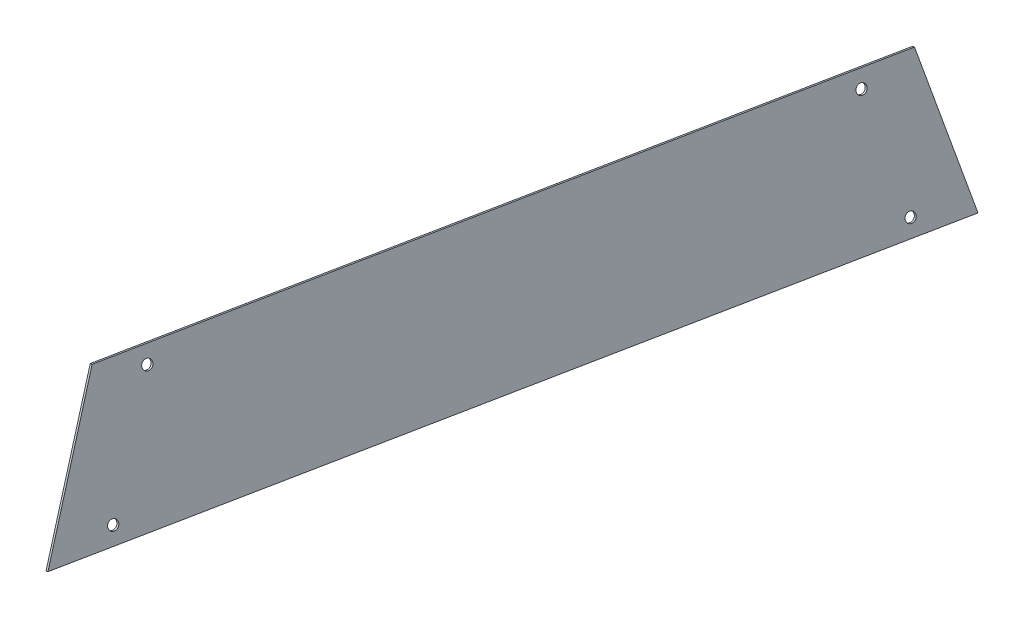
ISO-10303-21;
HEADER;
FILE_DESCRIPTION(('STEP AP214'),'2;1');
FILE_NAME('part.step','',(''),(''),'','','');
FILE_SCHEMA(('AUTOMOTIVE_DESIGN { 1 0 10303 214 1 1 1 1 }'));
ENDSEC;
DATA;
#1=APPLICATION_CONTEXT('core data for automotive mechanical design processes');
#2=APPLICATION_PROTOCOL_DEFINITION('international standard','automotive_design',2000,#1);
#3=PRODUCT_CONTEXT('',#1,'mechanical');
#4=PRODUCT('Part','Part','',(#3));
#5=PRODUCT_RELATED_PRODUCT_CATEGORY('part','',(#4));
#6=PRODUCT_DEFINITION_FORMATION('','',#4);
#7=PRODUCT_DEFINITION_CONTEXT('part definition',#1,'design');
#8=PRODUCT_DEFINITION('design','',#6,#7);
#9=PRODUCT_DEFINITION_SHAPE('','',#8);
#10=(LENGTH_UNIT() NAMED_UNIT(*) SI_UNIT(.MILLI.,.METRE.));
#11=(NAMED_UNIT(*) PLANE_ANGLE_UNIT() SI_UNIT($,.RADIAN.));
#12=(NAMED_UNIT(*) SI_UNIT($,.STERADIAN.) SOLID_ANGLE_UNIT());
#13=UNCERTAINTY_MEASURE_WITH_UNIT(LENGTH_MEASURE(1.E-05),#10,'distance_accuracy_value','');
#14=(GEOMETRIC_REPRESENTATION_CONTEXT(3) GLOBAL_UNCERTAINTY_ASSIGNED_CONTEXT((#13)) GLOBAL_UNIT_ASSIGNED_CONTEXT((#10,
#11,#12)) REPRESENTATION_CONTEXT('',''));
#15=CARTESIAN_POINT('',(0.,0.,0.));
#16=DIRECTION('',(0.,0.,1.));
#17=DIRECTION('',(1.,0.,0.));
#18=AXIS2_PLACEMENT_3D('',#15,#16,#17);
#19=CARTESIAN_POINT('',(292.210469043144,549.389262284747,1453.34734356369));
#20=DIRECTION('',(0.293132454914824,-0.954292497221213,0.0583026039119149));
#21=DIRECTION('',(0.955918556350323,0.293631935635609,0.));
#22=AXIS2_PLACEMENT_3D('',#19,#20,#21);
#23=PLANE('',#22);
#24=DIRECTION('',(-0.195073763499262,8.02316127265634E-08,0.980788573951709));
#25=VECTOR('',#24,1.);
#26=CARTESIAN_POINT('',(290.806530269904,548.940950878545,1453.0681074556));
#27=LINE('',#26,#25);
#28=CARTESIAN_POINT('',(290.806530269904,548.940950878545,1453.0681074556));
#29=VERTEX_POINT('',#28);
#30=CARTESIAN_POINT('',(210.808799905034,548.940983780698,1855.27934527914));
#31=VERTEX_POINT('',#30);
#32=EDGE_CURVE('E101',#29,#31,#27,.T.);
#33=ORIENTED_EDGE('',*,*,#32,.T.);
#34=DIRECTION('',(-0.935959182160121,-0.298874270801778,-0.186157405393561));
#35=VECTOR('',#34,1.);
#36=CARTESIAN_POINT('',(212.212738678274,549.389295186901,1855.55858138723));
#37=LINE('',#36,#35);
#38=CARTESIAN_POINT('',(212.212738678274,549.389295186901,1855.55858138723));
#39=VERTEX_POINT('',#38);
#40=EDGE_CURVE('E11',#39,#31,#37,.T.);
#41=ORIENTED_EDGE('',*,*,#40,.F.);
#42=DIRECTION('',(-0.195073763499262,8.02316127265634E-08,0.980788573951709));
#43=VECTOR('',#42,1.);
#44=CARTESIAN_POINT('',(292.210469043144,549.389262284747,1453.34734356369));
#45=LINE('',#44,#43);
#46=CARTESIAN_POINT('',(292.210469043144,549.389262284747,1453.34734356369));
#47=VERTEX_POINT('',#46);
#48=EDGE_CURVE('E88',#47,#39,#45,.T.);
#49=ORIENTED_EDGE('',*,*,#48,.F.);
#50=DIRECTION('',(-0.935959182160121,-0.298874270801778,-0.186157405393561));
#51=VECTOR('',#50,1.);
#52=CARTESIAN_POINT('',(292.210469043144,549.389262284747,1453.34734356369));
#53=LINE('',#52,#51);
#54=EDGE_CURVE('E97',#47,#29,#53,.T.);
#55=ORIENTED_EDGE('',*,*,#54,.T.);
#56=EDGE_LOOP('',(#33,#41,#49,#55));
#57=FACE_BOUND('',#56,.T.);
#58=ADVANCED_FACE('F35',(#57),#23,.F.);
#59=CARTESIAN_POINT('',(212.212738678274,549.389295186901,1855.55858138723));
#60=DIRECTION('',(0.302048266778896,-0.409788813161851,-0.860720612709644));
#61=DIRECTION('',(0.,0.902892336228117,-0.429866757473212));
#62=AXIS2_PLACEMENT_3D('',#59,#60,#61);
#63=PLANE('',#62);
#64=DIRECTION('',(0.180962023270137,-0.861827882387259,0.473820057905817));
#65=VECTOR('',#64,1.);
#66=CARTESIAN_POINT('',(210.808799905034,548.940983780698,1855.27934527914));
#67=LINE('',#66,#65);
#68=CARTESIAN_POINT('',(226.838979268158,472.597587054934,1897.25180102881));
#69=VERTEX_POINT('',#68);
#70=EDGE_CURVE('E92',#31,#69,#67,.T.);
#71=ORIENTED_EDGE('',*,*,#70,.T.);
#72=DIRECTION('',(-0.935959182160121,-0.298874270801778,-0.186157405393561));
#73=VECTOR('',#72,1.);
#74=CARTESIAN_POINT('',(228.242918041398,473.045898461137,1897.5310371369));
#75=LINE('',#74,#73);
#76=CARTESIAN_POINT('',(228.242918041398,473.045898461137,1897.5310371369));
#77=VERTEX_POINT('',#76);
#78=EDGE_CURVE('E44',#77,#69,#75,.T.);
#79=ORIENTED_EDGE('',*,*,#78,.F.);
#80=DIRECTION('',(0.180962023270137,-0.861827882387259,0.473820057905817));
#81=VECTOR('',#80,1.);
#82=CARTESIAN_POINT('',(212.212738678274,549.389295186901,1855.55858138723));
#83=LINE('',#82,#81);
#84=EDGE_CURVE('E83',#39,#77,#83,.T.);
#85=ORIENTED_EDGE('',*,*,#84,.F.);
#86=ORIENTED_EDGE('',*,*,#40,.T.);
#87=EDGE_LOOP('',(#71,#79,#85,#86));
#88=FACE_BOUND('',#87,.T.);
#89=ADVANCED_FACE('F91',(#88),#63,.F.);
#90=CARTESIAN_POINT('',(228.242918041398,473.045898461137,1897.5310371369));
#91=DIRECTION('',(-0.293132454914823,0.954292497221213,-0.0583026039119152));
#92=DIRECTION('',(-0.955918556350323,-0.293631935635609,0.));
#93=AXIS2_PLACEMENT_3D('',#90,#91,#92);
#94=PLANE('',#93);
#95=DIRECTION('',(0.195073763499262,-8.02316129924446E-08,-0.980788573951709));
#96=VECTOR('',#95,1.);
#97=CARTESIAN_POINT('',(226.838979268158,472.597587054934,1897.25180102881));
#98=LINE('',#97,#96);
#99=CARTESIAN_POINT('',(317.318428002222,472.597549841769,1442.34075659122));
#100=VERTEX_POINT('',#99);
#101=EDGE_CURVE('E70',#69,#100,#98,.T.);
#102=ORIENTED_EDGE('',*,*,#101,.T.);
#103=DIRECTION('',(-0.935959182160121,-0.298874270801778,-0.186157405393561));
#104=VECTOR('',#103,1.);
#105=CARTESIAN_POINT('',(318.722366775463,473.045861247972,1442.61999269931));
#106=LINE('',#105,#104);
#107=CARTESIAN_POINT('',(318.722366775463,473.045861247972,1442.61999269931));
#108=VERTEX_POINT('',#107);
#109=EDGE_CURVE('E93',#108,#100,#106,.T.);
#110=ORIENTED_EDGE('',*,*,#109,.F.);
#111=DIRECTION('',(0.195073763499262,-8.02316129924446E-08,-0.980788573951709));
#112=VECTOR('',#111,1.);
#113=CARTESIAN_POINT('',(228.242918041398,473.045898461137,1897.5310371369));
#114=LINE('',#113,#112);
#115=EDGE_CURVE('E86',#77,#108,#114,.T.);
#116=ORIENTED_EDGE('',*,*,#115,.F.);
#117=ORIENTED_EDGE('',*,*,#78,.T.);
#118=EDGE_LOOP('',(#102,#110,#116,#117));
#119=FACE_BOUND('',#118,.T.);
#120=ADVANCED_FACE('F95',(#119),#94,.F.);
#121=CARTESIAN_POINT('',(318.722366775463,473.045861247972,1442.61999269931));
#122=DIRECTION('',(-0.134999140998528,-0.183695914556917,0.973668856904008));
#123=DIRECTION('',(0.,-0.982664446815739,-0.185393055329262));
#124=AXIS2_PLACEMENT_3D('',#121,#122,#123);
#125=PLANE('',#124);
#126=DIRECTION('',(-0.325200924444899,0.936445396821301,0.131584108130046));
#127=VECTOR('',#126,1.);
#128=CARTESIAN_POINT('',(317.318428002222,472.597549841769,1442.34075659122));
#129=LINE('',#128,#127);
#130=EDGE_CURVE('E76',#100,#29,#129,.T.);
#131=ORIENTED_EDGE('',*,*,#130,.T.);
#132=ORIENTED_EDGE('',*,*,#54,.F.);
#133=DIRECTION('',(-0.325200924444899,0.936445396821301,0.131584108130046));
#134=VECTOR('',#133,1.);
#135=CARTESIAN_POINT('',(318.722366775463,473.045861247972,1442.61999269931));
#136=LINE('',#135,#134);
#137=EDGE_CURVE('E53',#108,#47,#136,.T.);
#138=ORIENTED_EDGE('',*,*,#137,.F.);
#139=ORIENTED_EDGE('',*,*,#109,.T.);
#140=EDGE_LOOP('',(#131,#132,#138,#139));
#141=FACE_BOUND('',#140,.T.);
#142=ADVANCED_FACE('F151',(#141),#125,.F.);
#143=CARTESIAN_POINT('',(662.890055813711,211.676733162471,131.845378734008));
#144=DIRECTION('',(-0.935959182160121,-0.298874270801778,-0.186157405393561));
#145=DIRECTION('',(0.304191559381334,-0.952610883415234,0.));
#146=AXIS2_PLACEMENT_3D('',#143,#144,#145);
#147=PLANE('',#146);
#148=CARTESIAN_POINT('',(232.289184686551,481.704077662603,1863.28664378692));
#149=DIRECTION('',(-0.935959182160121,-0.298874270801778,-0.186157405393561));
#150=DIRECTION('',(0.304191559381334,-0.952610883415234,0.));
#151=AXIS2_PLACEMENT_3D('',#148,#149,#150);
#152=CIRCLE('',#151,2.74999999999996);
#153=CARTESIAN_POINT('',(233.12571147485,479.084397733211,1863.28664378692));
#154=VERTEX_POINT('',#153);
#155=EDGE_CURVE('E104',#154,#154,#152,.T.);
#156=ORIENTED_EDGE('',*,*,#155,.T.);
#157=EDGE_LOOP('',(#156));
#158=FACE_BOUND('',#157,.T.);
#159=CARTESIAN_POINT('',(309.863412811974,481.704045757208,1473.2602495977));
#160=DIRECTION('',(-0.935959182160121,-0.298874270801778,-0.186157405393561));
#161=DIRECTION('',(0.304191559381334,-0.952610883415234,0.));
#162=AXIS2_PLACEMENT_3D('',#159,#160,#161);
#163=CIRCLE('',#162,2.74999999999994);
#164=CARTESIAN_POINT('',(310.699939600273,479.084365827816,1473.2602495977));
#165=VERTEX_POINT('',#164);
#166=EDGE_CURVE('E119',#165,#165,#163,.T.);
#167=ORIENTED_EDGE('',*,*,#166,.T.);
#168=EDGE_LOOP('',(#167));
#169=FACE_BOUND('',#168,.T.);
#170=CARTESIAN_POINT('',(289.364997196677,540.731082589409,1481.55440110241));
#171=DIRECTION('',(-0.935959182160121,-0.298874270801778,-0.186157405393561));
#172=DIRECTION('',(0.304191559381334,-0.952610883415234,0.));
#173=AXIS2_PLACEMENT_3D('',#170,#171,#172);
#174=CIRCLE('',#173,2.74999999999994);
#175=CARTESIAN_POINT('',(290.201523984975,538.111402660017,1481.55440110241));
#176=VERTEX_POINT('',#175);
#177=EDGE_CURVE('E116',#176,#176,#174,.T.);
#178=ORIENTED_EDGE('',*,*,#177,.T.);
#179=EDGE_LOOP('',(#178));
#180=FACE_BOUND('',#179,.T.);
#181=CARTESIAN_POINT('',(219.882950390921,540.731111166584,1830.89506270358));
#182=DIRECTION('',(-0.935959182160121,-0.298874270801778,-0.186157405393561));
#183=DIRECTION('',(0.304191559381334,-0.952610883415234,0.));
#184=AXIS2_PLACEMENT_3D('',#181,#182,#183);
#185=CIRCLE('',#184,2.74999999999994);
#186=CARTESIAN_POINT('',(220.719477179219,538.111431237192,1830.89506270358));
#187=VERTEX_POINT('',#186);
#188=EDGE_CURVE('E113',#187,#187,#185,.T.);
#189=ORIENTED_EDGE('',*,*,#188,.T.);
#190=EDGE_LOOP('',(#189));
#191=FACE_BOUND('',#190,.T.);
#192=ORIENTED_EDGE('',*,*,#48,.T.);
#193=ORIENTED_EDGE('',*,*,#84,.T.);
#194=ORIENTED_EDGE('',*,*,#115,.T.);
#195=ORIENTED_EDGE('',*,*,#137,.T.);
#196=EDGE_LOOP('',(#192,#193,#194,#195));
#197=FACE_BOUND('',#196,.T.);
#198=ADVANCED_FACE('F84',(#158,#169,#180,#191,#197),#147,.F.);
#199=CARTESIAN_POINT('',(661.486117040471,211.228421756269,131.566142625918));
#200=DIRECTION('',(-0.935959182160121,-0.298874270801778,-0.186157405393561));
#201=DIRECTION('',(0.304191559381334,-0.952610883415234,0.));
#202=AXIS2_PLACEMENT_3D('',#199,#200,#201);
#203=PLANE('',#202);
#204=CARTESIAN_POINT('',(230.885245913311,481.2557662564,1863.00740767883));
#205=DIRECTION('',(-0.935959182160121,-0.298874270801778,-0.186157405393561));
#206=DIRECTION('',(0.304191559381334,-0.952610883415234,0.));
#207=AXIS2_PLACEMENT_3D('',#204,#205,#206);
#208=CIRCLE('',#207,2.74999999999996);
#209=CARTESIAN_POINT('',(231.721772701609,478.636086327008,1863.00740767883));
#210=VERTEX_POINT('',#209);
#211=EDGE_CURVE('E38',#210,#210,#208,.T.);
#212=ORIENTED_EDGE('',*,*,#211,.F.);
#213=EDGE_LOOP('',(#212));
#214=FACE_BOUND('',#213,.T.);
#215=CARTESIAN_POINT('',(308.459474038734,481.255734351005,1472.98101348961));
#216=DIRECTION('',(-0.935959182160121,-0.298874270801778,-0.186157405393561));
#217=DIRECTION('',(0.304191559381334,-0.952610883415234,0.));
#218=AXIS2_PLACEMENT_3D('',#215,#216,#217);
#219=CIRCLE('',#218,2.74999999999994);
#220=CARTESIAN_POINT('',(309.296000827033,478.636054421613,1472.98101348961));
#221=VERTEX_POINT('',#220);
#222=EDGE_CURVE('E117',#221,#221,#219,.T.);
#223=ORIENTED_EDGE('',*,*,#222,.F.);
#224=EDGE_LOOP('',(#223));
#225=FACE_BOUND('',#224,.T.);
#226=CARTESIAN_POINT('',(287.961058423437,540.282771183207,1481.27516499432));
#227=DIRECTION('',(-0.935959182160121,-0.298874270801778,-0.186157405393561));
#228=DIRECTION('',(0.304191559381334,-0.952610883415234,0.));
#229=AXIS2_PLACEMENT_3D('',#226,#227,#228);
#230=CIRCLE('',#229,2.74999999999994);
#231=CARTESIAN_POINT('',(288.797585211735,537.663091253815,1481.27516499432));
#232=VERTEX_POINT('',#231);
#233=EDGE_CURVE('E114',#232,#232,#230,.T.);
#234=ORIENTED_EDGE('',*,*,#233,.F.);
#235=EDGE_LOOP('',(#234));
#236=FACE_BOUND('',#235,.T.);
#237=CARTESIAN_POINT('',(218.47901161768,540.282799760381,1830.61582659549));
#238=DIRECTION('',(-0.935959182160121,-0.298874270801778,-0.186157405393561));
#239=DIRECTION('',(0.304191559381334,-0.952610883415234,0.));
#240=AXIS2_PLACEMENT_3D('',#237,#238,#239);
#241=CIRCLE('',#240,2.74999999999994);
#242=CARTESIAN_POINT('',(219.315538405979,537.663119830989,1830.61582659549));
#243=VERTEX_POINT('',#242);
#244=EDGE_CURVE('E110',#243,#243,#241,.T.);
#245=ORIENTED_EDGE('',*,*,#244,.F.);
#246=EDGE_LOOP('',(#245));
#247=FACE_BOUND('',#246,.T.);
#248=ORIENTED_EDGE('',*,*,#32,.F.);
#249=ORIENTED_EDGE('',*,*,#130,.F.);
#250=ORIENTED_EDGE('',*,*,#101,.F.);
#251=ORIENTED_EDGE('',*,*,#70,.F.);
#252=EDGE_LOOP('',(#248,#249,#250,#251));
#253=FACE_BOUND('',#252,.T.);
#254=ADVANCED_FACE('F139',(#214,#225,#236,#247,#253),#203,.T.);
#255=CARTESIAN_POINT('',(125.174490809584,510.488422878828,1812.05804348252));
#256=DIRECTION('',(0.935959182160121,0.298874270801778,0.186157405393561));
#257=DIRECTION('',(-0.304191559381334,0.952610883415234,0.));
#258=AXIS2_PLACEMENT_3D('',#255,#256,#257);
#259=CYLINDRICAL_SURFACE('',#258,2.74999999999994);
#260=ORIENTED_EDGE('',*,*,#244,.T.);
#261=EDGE_LOOP('',(#260));
#262=FACE_BOUND('',#261,.T.);
#263=ORIENTED_EDGE('',*,*,#188,.F.);
#264=EDGE_LOOP('',(#263));
#265=FACE_BOUND('',#264,.T.);
#266=ADVANCED_FACE('F142',(#262,#265),#259,.F.);
#267=CARTESIAN_POINT('',(194.65653761534,510.488394301653,1462.71738188134));
#268=DIRECTION('',(0.935959182160121,0.298874270801778,0.186157405393561));
#269=DIRECTION('',(-0.304191559381334,0.952610883415234,0.));
#270=AXIS2_PLACEMENT_3D('',#267,#268,#269);
#271=CYLINDRICAL_SURFACE('',#270,2.74999999999994);
#272=ORIENTED_EDGE('',*,*,#233,.T.);
#273=EDGE_LOOP('',(#272));
#274=FACE_BOUND('',#273,.T.);
#275=ORIENTED_EDGE('',*,*,#177,.F.);
#276=EDGE_LOOP('',(#275));
#277=FACE_BOUND('',#276,.T.);
#278=ADVANCED_FACE('F195',(#274,#277),#271,.F.);
#279=CARTESIAN_POINT('',(215.154953230637,451.461357469452,1454.42323037663));
#280=DIRECTION('',(0.935959182160121,0.298874270801778,0.186157405393561));
#281=DIRECTION('',(-0.304191559381334,0.952610883415234,0.));
#282=AXIS2_PLACEMENT_3D('',#279,#280,#281);
#283=CYLINDRICAL_SURFACE('',#282,2.74999999999994);
#284=ORIENTED_EDGE('',*,*,#222,.T.);
#285=EDGE_LOOP('',(#284));
#286=FACE_BOUND('',#285,.T.);
#287=ORIENTED_EDGE('',*,*,#166,.F.);
#288=EDGE_LOOP('',(#287));
#289=FACE_BOUND('',#288,.T.);
#290=ADVANCED_FACE('F205',(#286,#289),#283,.F.);
#291=CARTESIAN_POINT('',(137.580725105214,451.461389374846,1844.44962456586));
#292=DIRECTION('',(0.935959182160121,0.298874270801778,0.186157405393561));
#293=DIRECTION('',(-0.304191559381334,0.952610883415234,0.));
#294=AXIS2_PLACEMENT_3D('',#291,#292,#293);
#295=CYLINDRICAL_SURFACE('',#294,2.74999999999996);
#296=ORIENTED_EDGE('',*,*,#211,.T.);
#297=EDGE_LOOP('',(#296));
#298=FACE_BOUND('',#297,.T.);
#299=ORIENTED_EDGE('',*,*,#155,.F.);
#300=EDGE_LOOP('',(#299));
#301=FACE_BOUND('',#300,.T.);
#302=ADVANCED_FACE('F136',(#298,#301),#295,.F.);
#303=CLOSED_SHELL('',(#58,#89,#120,#142,#198,#254,#266,#278,#290,#302));
#304=MANIFOLD_SOLID_BREP('B2',#303);
#305=ADVANCED_BREP_SHAPE_REPRESENTATION('',(#18,#304),#14);
#306=SHAPE_DEFINITION_REPRESENTATION(#9,#305);
ENDSEC;
END-ISO-10303-21;
